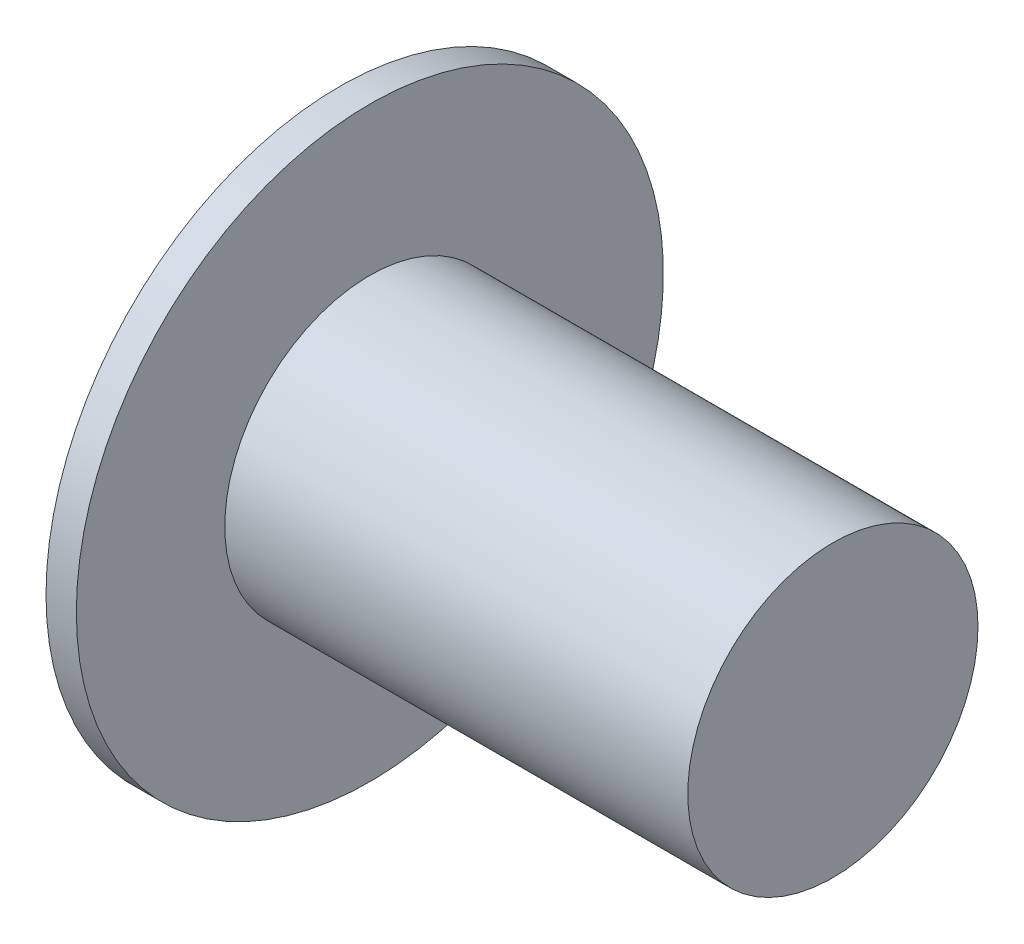
ISO-10303-21;
HEADER;
FILE_DESCRIPTION(('STEP AP214'),'2;1');
FILE_NAME('part.step','',(''),(''),'','','');
FILE_SCHEMA(('AUTOMOTIVE_DESIGN { 1 0 10303 214 1 1 1 1 }'));
ENDSEC;
DATA;
#1=APPLICATION_CONTEXT('core data for automotive mechanical design processes');
#2=APPLICATION_PROTOCOL_DEFINITION('international standard','automotive_design',2000,#1);
#3=PRODUCT_CONTEXT('',#1,'mechanical');
#4=PRODUCT('Part','Part','',(#3));
#5=PRODUCT_RELATED_PRODUCT_CATEGORY('part','',(#4));
#6=PRODUCT_DEFINITION_FORMATION('','',#4);
#7=PRODUCT_DEFINITION_CONTEXT('part definition',#1,'design');
#8=PRODUCT_DEFINITION('design','',#6,#7);
#9=PRODUCT_DEFINITION_SHAPE('','',#8);
#10=(LENGTH_UNIT() NAMED_UNIT(*) SI_UNIT(.MILLI.,.METRE.));
#11=(NAMED_UNIT(*) PLANE_ANGLE_UNIT() SI_UNIT($,.RADIAN.));
#12=(NAMED_UNIT(*) SI_UNIT($,.STERADIAN.) SOLID_ANGLE_UNIT());
#13=UNCERTAINTY_MEASURE_WITH_UNIT(LENGTH_MEASURE(1.E-05),#10,'distance_accuracy_value','');
#14=(GEOMETRIC_REPRESENTATION_CONTEXT(3) GLOBAL_UNCERTAINTY_ASSIGNED_CONTEXT((#13)) GLOBAL_UNIT_ASSIGNED_CONTEXT((#10,
#11,#12)) REPRESENTATION_CONTEXT('',''));
#15=CARTESIAN_POINT('',(0.,0.,0.));
#16=DIRECTION('',(0.,0.,1.));
#17=DIRECTION('',(1.,0.,0.));
#18=AXIS2_PLACEMENT_3D('',#15,#16,#17);
#19=CARTESIAN_POINT('',(35.1,0.,0.));
#20=DIRECTION('',(-1.,0.,0.));
#21=DIRECTION('',(0.,0.,1.));
#22=AXIS2_PLACEMENT_3D('',#19,#20,#21);
#23=CYLINDRICAL_SURFACE('',#22,11.);
#24=CARTESIAN_POINT('',(35.1,0.,0.));
#25=DIRECTION('',(1.,0.,0.));
#26=DIRECTION('',(0.,0.,-1.));
#27=AXIS2_PLACEMENT_3D('',#24,#25,#26);
#28=CIRCLE('',#27,11.);
#29=CARTESIAN_POINT('',(35.1,0.,-11.));
#30=VERTEX_POINT('',#29);
#31=EDGE_CURVE('E57',#30,#30,#28,.T.);
#32=ORIENTED_EDGE('',*,*,#31,.F.);
#33=EDGE_LOOP('',(#32));
#34=FACE_BOUND('',#33,.T.);
#35=CARTESIAN_POINT('',(0.,0.,0.));
#36=DIRECTION('',(1.,0.,0.));
#37=DIRECTION('',(0.,0.,-1.));
#38=AXIS2_PLACEMENT_3D('',#35,#36,#37);
#39=CIRCLE('',#38,11.);
#40=CARTESIAN_POINT('',(0.,0.,-11.));
#41=VERTEX_POINT('',#40);
#42=EDGE_CURVE('E46',#41,#41,#39,.T.);
#43=ORIENTED_EDGE('',*,*,#42,.T.);
#44=EDGE_LOOP('',(#43));
#45=FACE_BOUND('',#44,.T.);
#46=ADVANCED_FACE('F43',(#34,#45),#23,.T.);
#47=CARTESIAN_POINT('',(35.1,0.,0.));
#48=DIRECTION('',(1.,0.,0.));
#49=DIRECTION('',(0.,0.,-1.));
#50=AXIS2_PLACEMENT_3D('',#47,#48,#49);
#51=PLANE('',#50);
#52=ORIENTED_EDGE('',*,*,#31,.T.);
#53=EDGE_LOOP('',(#52));
#54=FACE_BOUND('',#53,.T.);
#55=ADVANCED_FACE('F92',(#54),#51,.T.);
#56=CARTESIAN_POINT('',(-2.3,0.,0.));
#57=DIRECTION('',(1.,0.,0.));
#58=DIRECTION('',(0.,0.,-1.));
#59=AXIS2_PLACEMENT_3D('',#56,#57,#58);
#60=CYLINDRICAL_SURFACE('',#59,22.25);
#61=CARTESIAN_POINT('',(-2.3,0.,0.));
#62=DIRECTION('',(-1.,0.,0.));
#63=DIRECTION('',(0.,0.,1.));
#64=AXIS2_PLACEMENT_3D('',#61,#62,#63);
#65=CIRCLE('',#64,22.25);
#66=CARTESIAN_POINT('',(-2.3,0.,22.25));
#67=VERTEX_POINT('',#66);
#68=EDGE_CURVE('E67',#67,#67,#65,.T.);
#69=ORIENTED_EDGE('',*,*,#68,.F.);
#70=EDGE_LOOP('',(#69));
#71=FACE_BOUND('',#70,.T.);
#72=CARTESIAN_POINT('',(0.,0.,0.));
#73=DIRECTION('',(-1.,0.,0.));
#74=DIRECTION('',(0.,0.,1.));
#75=AXIS2_PLACEMENT_3D('',#72,#73,#74);
#76=CIRCLE('',#75,22.25);
#77=CARTESIAN_POINT('',(0.,0.,22.25));
#78=VERTEX_POINT('',#77);
#79=EDGE_CURVE('E65',#78,#78,#76,.T.);
#80=ORIENTED_EDGE('',*,*,#79,.T.);
#81=EDGE_LOOP('',(#80));
#82=FACE_BOUND('',#81,.T.);
#83=ADVANCED_FACE('F90',(#71,#82),#60,.T.);
#84=CARTESIAN_POINT('',(-2.3,0.,0.));
#85=DIRECTION('',(-1.,0.,0.));
#86=DIRECTION('',(0.,0.,1.));
#87=AXIS2_PLACEMENT_3D('',#84,#85,#86);
#88=PLANE('',#87);
#89=CARTESIAN_POINT('',(-2.3,0.,0.));
#90=DIRECTION('',(-1.,0.,0.));
#91=DIRECTION('',(0.,0.,1.));
#92=AXIS2_PLACEMENT_3D('',#89,#90,#91);
#93=CIRCLE('',#92,11.);
#94=CARTESIAN_POINT('',(-2.3,0.,11.));
#95=VERTEX_POINT('',#94);
#96=EDGE_CURVE('E51',#95,#95,#93,.T.);
#97=ORIENTED_EDGE('',*,*,#96,.F.);
#98=EDGE_LOOP('',(#97));
#99=FACE_BOUND('',#98,.T.);
#100=ORIENTED_EDGE('',*,*,#68,.T.);
#101=EDGE_LOOP('',(#100));
#102=FACE_BOUND('',#101,.T.);
#103=ADVANCED_FACE('F86',(#99,#102),#88,.T.);
#104=CARTESIAN_POINT('',(0.,0.,0.));
#105=DIRECTION('',(-1.,0.,0.));
#106=DIRECTION('',(0.,0.,1.));
#107=AXIS2_PLACEMENT_3D('',#104,#105,#106);
#108=PLANE('',#107);
#109=ORIENTED_EDGE('',*,*,#42,.F.);
#110=EDGE_LOOP('',(#109));
#111=FACE_BOUND('',#110,.T.);
#112=ORIENTED_EDGE('',*,*,#79,.F.);
#113=EDGE_LOOP('',(#112));
#114=FACE_BOUND('',#113,.T.);
#115=ADVANCED_FACE('F82',(#111,#114),#108,.F.);
#116=CARTESIAN_POINT('',(-7.3,0.,0.));
#117=DIRECTION('',(1.,0.,0.));
#118=DIRECTION('',(0.,0.,-1.));
#119=AXIS2_PLACEMENT_3D('',#116,#117,#118);
#120=CYLINDRICAL_SURFACE('',#119,11.);
#121=CARTESIAN_POINT('',(-7.3,0.,0.));
#122=DIRECTION('',(-1.,0.,0.));
#123=DIRECTION('',(0.,0.,1.));
#124=AXIS2_PLACEMENT_3D('',#121,#122,#123);
#125=CIRCLE('',#124,11.);
#126=CARTESIAN_POINT('',(-7.3,0.,11.));
#127=VERTEX_POINT('',#126);
#128=EDGE_CURVE('E62',#127,#127,#125,.T.);
#129=ORIENTED_EDGE('',*,*,#128,.F.);
#130=EDGE_LOOP('',(#129));
#131=FACE_BOUND('',#130,.T.);
#132=ORIENTED_EDGE('',*,*,#96,.T.);
#133=EDGE_LOOP('',(#132));
#134=FACE_BOUND('',#133,.T.);
#135=ADVANCED_FACE('F85',(#131,#134),#120,.T.);
#136=CARTESIAN_POINT('',(-7.3,0.,0.));
#137=DIRECTION('',(-1.,0.,0.));
#138=DIRECTION('',(0.,0.,1.));
#139=AXIS2_PLACEMENT_3D('',#136,#137,#138);
#140=PLANE('',#139);
#141=CARTESIAN_POINT('',(-7.3,0.,0.));
#142=DIRECTION('',(-1.,0.,0.));
#143=DIRECTION('',(0.,0.,1.));
#144=AXIS2_PLACEMENT_3D('',#141,#142,#143);
#145=CIRCLE('',#144,3.9);
#146=CARTESIAN_POINT('',(-7.3,0.,3.9));
#147=VERTEX_POINT('',#146);
#148=EDGE_CURVE('E10',#147,#147,#145,.T.);
#149=ORIENTED_EDGE('',*,*,#148,.F.);
#150=EDGE_LOOP('',(#149));
#151=FACE_BOUND('',#150,.T.);
#152=ORIENTED_EDGE('',*,*,#128,.T.);
#153=EDGE_LOOP('',(#152));
#154=FACE_BOUND('',#153,.T.);
#155=ADVANCED_FACE('F137',(#151,#154),#140,.T.);
#156=CARTESIAN_POINT('',(-14.84,0.,0.));
#157=DIRECTION('',(1.,0.,0.));
#158=DIRECTION('',(0.,0.,-1.));
#159=AXIS2_PLACEMENT_3D('',#156,#157,#158);
#160=CYLINDRICAL_SURFACE('',#159,3.9);
#161=CARTESIAN_POINT('',(-14.84,0.,0.));
#162=DIRECTION('',(-1.,0.,0.));
#163=DIRECTION('',(0.,0.,1.));
#164=AXIS2_PLACEMENT_3D('',#161,#162,#163);
#165=CIRCLE('',#164,3.9);
#166=CARTESIAN_POINT('',(-14.84,0.,3.9));
#167=VERTEX_POINT('',#166);
#168=EDGE_CURVE('E61',#167,#167,#165,.T.);
#169=ORIENTED_EDGE('',*,*,#168,.F.);
#170=EDGE_LOOP('',(#169));
#171=FACE_BOUND('',#170,.T.);
#172=ORIENTED_EDGE('',*,*,#148,.T.);
#173=EDGE_LOOP('',(#172));
#174=FACE_BOUND('',#173,.T.);
#175=ADVANCED_FACE('F147',(#171,#174),#160,.T.);
#176=CARTESIAN_POINT('',(-14.84,0.,0.));
#177=DIRECTION('',(-1.,0.,0.));
#178=DIRECTION('',(0.,0.,1.));
#179=AXIS2_PLACEMENT_3D('',#176,#177,#178);
#180=PLANE('',#179);
#181=ORIENTED_EDGE('',*,*,#168,.T.);
#182=EDGE_LOOP('',(#181));
#183=FACE_BOUND('',#182,.T.);
#184=ADVANCED_FACE('F157',(#183),#180,.T.);
#185=CLOSED_SHELL('',(#46,#55,#83,#103,#115,#135,#155,#175,#184));
#186=MANIFOLD_SOLID_BREP('B2',#185);
#187=ADVANCED_BREP_SHAPE_REPRESENTATION('',(#18,#186),#14);
#188=SHAPE_DEFINITION_REPRESENTATION(#9,#187);
ENDSEC;
END-ISO-10303-21;
